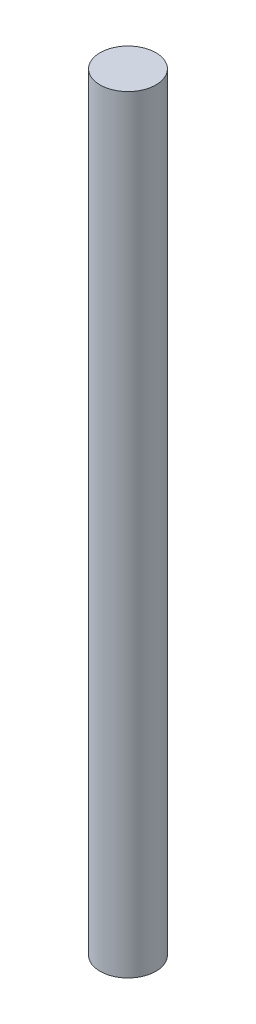
ISO-10303-21;
HEADER;
FILE_DESCRIPTION(('STEP AP214'),'2;1');
FILE_NAME('part.step','',(''),(''),'','','');
FILE_SCHEMA(('AUTOMOTIVE_DESIGN { 1 0 10303 214 1 1 1 1 }'));
ENDSEC;
DATA;
#1=APPLICATION_CONTEXT('core data for automotive mechanical design processes');
#2=APPLICATION_PROTOCOL_DEFINITION('international standard','automotive_design',2000,#1);
#3=PRODUCT_CONTEXT('',#1,'mechanical');
#4=PRODUCT('Part','Part','',(#3));
#5=PRODUCT_RELATED_PRODUCT_CATEGORY('part','',(#4));
#6=PRODUCT_DEFINITION_FORMATION('','',#4);
#7=PRODUCT_DEFINITION_CONTEXT('part definition',#1,'design');
#8=PRODUCT_DEFINITION('design','',#6,#7);
#9=PRODUCT_DEFINITION_SHAPE('','',#8);
#10=(LENGTH_UNIT() NAMED_UNIT(*) SI_UNIT(.MILLI.,.METRE.));
#11=(NAMED_UNIT(*) PLANE_ANGLE_UNIT() SI_UNIT($,.RADIAN.));
#12=(NAMED_UNIT(*) SI_UNIT($,.STERADIAN.) SOLID_ANGLE_UNIT());
#13=UNCERTAINTY_MEASURE_WITH_UNIT(LENGTH_MEASURE(1.E-05),#10,'distance_accuracy_value','');
#14=(GEOMETRIC_REPRESENTATION_CONTEXT(3) GLOBAL_UNCERTAINTY_ASSIGNED_CONTEXT((#13)) GLOBAL_UNIT_ASSIGNED_CONTEXT((#10,
#11,#12)) REPRESENTATION_CONTEXT('',''));
#15=CARTESIAN_POINT('',(0.,0.,0.));
#16=DIRECTION('',(0.,0.,1.));
#17=DIRECTION('',(1.,0.,0.));
#18=AXIS2_PLACEMENT_3D('',#15,#16,#17);
#19=CARTESIAN_POINT('',(0.,110.,0.));
#20=DIRECTION('',(0.,-1.,0.));
#21=DIRECTION('',(0.,0.,-1.));
#22=AXIS2_PLACEMENT_3D('',#19,#20,#21);
#23=CYLINDRICAL_SURFACE('',#22,4.);
#24=CARTESIAN_POINT('',(0.,110.,0.));
#25=DIRECTION('',(0.,1.,0.));
#26=DIRECTION('',(0.,0.,1.));
#27=AXIS2_PLACEMENT_3D('',#24,#25,#26);
#28=CIRCLE('',#27,4.);
#29=CARTESIAN_POINT('',(0.,110.,4.));
#30=VERTEX_POINT('',#29);
#31=EDGE_CURVE('E10',#30,#30,#28,.T.);
#32=ORIENTED_EDGE('',*,*,#31,.F.);
#33=EDGE_LOOP('',(#32));
#34=FACE_BOUND('',#33,.T.);
#35=CARTESIAN_POINT('',(0.,0.,0.));
#36=DIRECTION('',(0.,1.,0.));
#37=DIRECTION('',(0.,0.,1.));
#38=AXIS2_PLACEMENT_3D('',#35,#36,#37);
#39=CIRCLE('',#38,4.);
#40=CARTESIAN_POINT('',(0.,0.,4.));
#41=VERTEX_POINT('',#40);
#42=EDGE_CURVE('E36',#41,#41,#39,.T.);
#43=ORIENTED_EDGE('',*,*,#42,.T.);
#44=EDGE_LOOP('',(#43));
#45=FACE_BOUND('',#44,.T.);
#46=ADVANCED_FACE('F33',(#34,#45),#23,.T.);
#47=CARTESIAN_POINT('',(0.,110.,0.));
#48=DIRECTION('',(0.,1.,0.));
#49=DIRECTION('',(0.,0.,1.));
#50=AXIS2_PLACEMENT_3D('',#47,#48,#49);
#51=PLANE('',#50);
#52=ORIENTED_EDGE('',*,*,#31,.T.);
#53=EDGE_LOOP('',(#52));
#54=FACE_BOUND('',#53,.T.);
#55=ADVANCED_FACE('F48',(#54),#51,.T.);
#56=CARTESIAN_POINT('',(0.,0.,0.));
#57=DIRECTION('',(0.,1.,0.));
#58=DIRECTION('',(0.,0.,1.));
#59=AXIS2_PLACEMENT_3D('',#56,#57,#58);
#60=PLANE('',#59);
#61=ORIENTED_EDGE('',*,*,#42,.F.);
#62=EDGE_LOOP('',(#61));
#63=FACE_BOUND('',#62,.T.);
#64=ADVANCED_FACE('F46',(#63),#60,.F.);
#65=CLOSED_SHELL('',(#46,#55,#64));
#66=MANIFOLD_SOLID_BREP('B2',#65);
#67=ADVANCED_BREP_SHAPE_REPRESENTATION('',(#18,#66),#14);
#68=SHAPE_DEFINITION_REPRESENTATION(#9,#67);
ENDSEC;
END-ISO-10303-21;
